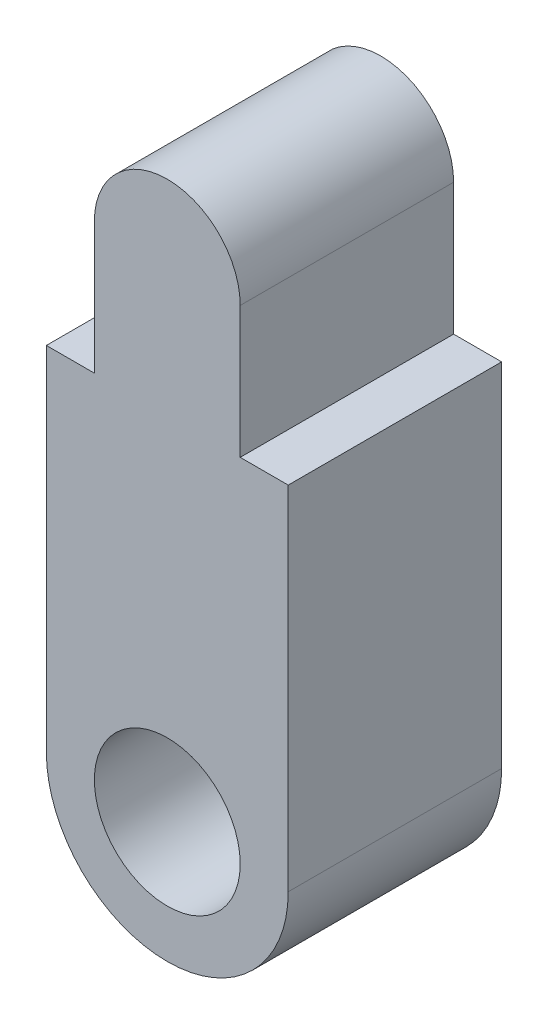
ISO-10303-21;
HEADER;
FILE_DESCRIPTION(('STEP AP214'),'2;1');
FILE_NAME('part.step','',(''),(''),'','','');
FILE_SCHEMA(('AUTOMOTIVE_DESIGN { 1 0 10303 214 1 1 1 1 }'));
ENDSEC;
DATA;
#1=APPLICATION_CONTEXT('core data for automotive mechanical design processes');
#2=APPLICATION_PROTOCOL_DEFINITION('international standard','automotive_design',2000,#1);
#3=PRODUCT_CONTEXT('',#1,'mechanical');
#4=PRODUCT('Part','Part','',(#3));
#5=PRODUCT_RELATED_PRODUCT_CATEGORY('part','',(#4));
#6=PRODUCT_DEFINITION_FORMATION('','',#4);
#7=PRODUCT_DEFINITION_CONTEXT('part definition',#1,'design');
#8=PRODUCT_DEFINITION('design','',#6,#7);
#9=PRODUCT_DEFINITION_SHAPE('','',#8);
#10=(LENGTH_UNIT() NAMED_UNIT(*) SI_UNIT(.MILLI.,.METRE.));
#11=(NAMED_UNIT(*) PLANE_ANGLE_UNIT() SI_UNIT($,.RADIAN.));
#12=(NAMED_UNIT(*) SI_UNIT($,.STERADIAN.) SOLID_ANGLE_UNIT());
#13=UNCERTAINTY_MEASURE_WITH_UNIT(LENGTH_MEASURE(1.E-05),#10,'distance_accuracy_value','');
#14=(GEOMETRIC_REPRESENTATION_CONTEXT(3) GLOBAL_UNCERTAINTY_ASSIGNED_CONTEXT((#13)) GLOBAL_UNIT_ASSIGNED_CONTEXT((#10,
#11,#12)) REPRESENTATION_CONTEXT('',''));
#15=CARTESIAN_POINT('',(0.,0.,0.));
#16=DIRECTION('',(0.,0.,1.));
#17=DIRECTION('',(1.,0.,0.));
#18=AXIS2_PLACEMENT_3D('',#15,#16,#17);
#19=CARTESIAN_POINT('',(-17.,0.,30.));
#20=DIRECTION('',(1.,0.,0.));
#21=DIRECTION('',(0.,1.,0.));
#22=AXIS2_PLACEMENT_3D('',#19,#20,#21);
#23=PLANE('',#22);
#24=DIRECTION('',(0.,-1.,0.));
#25=VECTOR('',#24,1.);
#26=CARTESIAN_POINT('',(-17.,0.,0.));
#27=LINE('',#26,#25);
#28=CARTESIAN_POINT('',(-17.,-18.4931792674009,0.));
#29=VERTEX_POINT('',#28);
#30=CARTESIAN_POINT('',(-17.,-68.,0.));
#31=VERTEX_POINT('',#30);
#32=EDGE_CURVE('E155',#29,#31,#27,.T.);
#33=ORIENTED_EDGE('',*,*,#32,.T.);
#34=DIRECTION('',(0.,0.,-1.));
#35=VECTOR('',#34,1.);
#36=CARTESIAN_POINT('',(-17.,-68.,30.));
#37=LINE('',#36,#35);
#38=CARTESIAN_POINT('',(-17.,-68.,30.));
#39=VERTEX_POINT('',#38);
#40=EDGE_CURVE('E11',#39,#31,#37,.T.);
#41=ORIENTED_EDGE('',*,*,#40,.F.);
#42=DIRECTION('',(0.,-1.,0.));
#43=VECTOR('',#42,1.);
#44=CARTESIAN_POINT('',(-17.,0.,30.));
#45=LINE('',#44,#43);
#46=CARTESIAN_POINT('',(-17.,-18.4931792674009,30.));
#47=VERTEX_POINT('',#46);
#48=EDGE_CURVE('E211',#47,#39,#45,.T.);
#49=ORIENTED_EDGE('',*,*,#48,.F.);
#50=DIRECTION('',(0.,0.,-1.));
#51=VECTOR('',#50,1.);
#52=CARTESIAN_POINT('',(-17.,-18.4931792674009,30.));
#53=LINE('',#52,#51);
#54=EDGE_CURVE('E65',#47,#29,#53,.T.);
#55=ORIENTED_EDGE('',*,*,#54,.T.);
#56=EDGE_LOOP('',(#33,#41,#49,#55));
#57=FACE_BOUND('',#56,.T.);
#58=ADVANCED_FACE('F47',(#57),#23,.F.);
#59=CARTESIAN_POINT('',(0.,-68.,30.));
#60=DIRECTION('',(0.,0.,-1.));
#61=DIRECTION('',(-1.,0.,0.));
#62=AXIS2_PLACEMENT_3D('',#59,#60,#61);
#63=CYLINDRICAL_SURFACE('',#62,17.);
#64=CARTESIAN_POINT('',(0.,-68.,0.));
#65=DIRECTION('',(0.,0.,1.));
#66=DIRECTION('',(1.,0.,0.));
#67=AXIS2_PLACEMENT_3D('',#64,#65,#66);
#68=CIRCLE('',#67,17.);
#69=CARTESIAN_POINT('',(17.,-68.,0.));
#70=VERTEX_POINT('',#69);
#71=EDGE_CURVE('E158',#31,#70,#68,.T.);
#72=ORIENTED_EDGE('',*,*,#71,.T.);
#73=DIRECTION('',(0.,0.,-1.));
#74=VECTOR('',#73,1.);
#75=CARTESIAN_POINT('',(17.,-68.,30.));
#76=LINE('',#75,#74);
#77=CARTESIAN_POINT('',(17.,-68.,30.));
#78=VERTEX_POINT('',#77);
#79=EDGE_CURVE('E57',#78,#70,#76,.T.);
#80=ORIENTED_EDGE('',*,*,#79,.F.);
#81=CARTESIAN_POINT('',(0.,-68.,30.));
#82=DIRECTION('',(0.,0.,1.));
#83=DIRECTION('',(1.,0.,0.));
#84=AXIS2_PLACEMENT_3D('',#81,#82,#83);
#85=CIRCLE('',#84,17.);
#86=EDGE_CURVE('E104',#39,#78,#85,.T.);
#87=ORIENTED_EDGE('',*,*,#86,.F.);
#88=ORIENTED_EDGE('',*,*,#40,.T.);
#89=EDGE_LOOP('',(#72,#80,#87,#88));
#90=FACE_BOUND('',#89,.T.);
#91=ADVANCED_FACE('F198',(#90),#63,.T.);
#92=CARTESIAN_POINT('',(17.,0.,30.));
#93=DIRECTION('',(1.,0.,0.));
#94=DIRECTION('',(0.,1.,0.));
#95=AXIS2_PLACEMENT_3D('',#92,#93,#94);
#96=PLANE('',#95);
#97=DIRECTION('',(0.,-1.,0.));
#98=VECTOR('',#97,1.);
#99=CARTESIAN_POINT('',(17.,0.,0.));
#100=LINE('',#99,#98);
#101=CARTESIAN_POINT('',(17.,-18.4931792674009,0.));
#102=VERTEX_POINT('',#101);
#103=EDGE_CURVE('E162',#102,#70,#100,.T.);
#104=ORIENTED_EDGE('',*,*,#103,.F.);
#105=DIRECTION('',(0.,0.,-1.));
#106=VECTOR('',#105,1.);
#107=CARTESIAN_POINT('',(17.,-18.4931792674009,30.));
#108=LINE('',#107,#106);
#109=CARTESIAN_POINT('',(17.,-18.4931792674009,30.));
#110=VERTEX_POINT('',#109);
#111=EDGE_CURVE('E189',#110,#102,#108,.T.);
#112=ORIENTED_EDGE('',*,*,#111,.F.);
#113=DIRECTION('',(0.,-1.,0.));
#114=VECTOR('',#113,1.);
#115=CARTESIAN_POINT('',(17.,0.,30.));
#116=LINE('',#115,#114);
#117=EDGE_CURVE('E197',#110,#78,#116,.T.);
#118=ORIENTED_EDGE('',*,*,#117,.T.);
#119=ORIENTED_EDGE('',*,*,#79,.T.);
#120=EDGE_LOOP('',(#104,#112,#118,#119));
#121=FACE_BOUND('',#120,.T.);
#122=ADVANCED_FACE('F195',(#121),#96,.T.);
#123=CARTESIAN_POINT('',(0.,-18.4931792674009,30.));
#124=DIRECTION('',(0.,1.,0.));
#125=DIRECTION('',(0.,0.,1.));
#126=AXIS2_PLACEMENT_3D('',#123,#124,#125);
#127=PLANE('',#126);
#128=DIRECTION('',(1.,0.,0.));
#129=VECTOR('',#128,1.);
#130=CARTESIAN_POINT('',(0.,-18.4931792674009,0.));
#131=LINE('',#130,#129);
#132=CARTESIAN_POINT('',(10.25,-18.4931792674009,0.));
#133=VERTEX_POINT('',#132);
#134=EDGE_CURVE('E166',#133,#102,#131,.T.);
#135=ORIENTED_EDGE('',*,*,#134,.F.);
#136=DIRECTION('',(0.,0.,-1.));
#137=VECTOR('',#136,1.);
#138=CARTESIAN_POINT('',(10.25,-18.4931792674009,30.));
#139=LINE('',#138,#137);
#140=CARTESIAN_POINT('',(10.25,-18.4931792674009,30.));
#141=VERTEX_POINT('',#140);
#142=EDGE_CURVE('E186',#141,#133,#139,.T.);
#143=ORIENTED_EDGE('',*,*,#142,.F.);
#144=DIRECTION('',(1.,0.,0.));
#145=VECTOR('',#144,1.);
#146=CARTESIAN_POINT('',(0.,-18.4931792674009,30.));
#147=LINE('',#146,#145);
#148=EDGE_CURVE('E148',#141,#110,#147,.T.);
#149=ORIENTED_EDGE('',*,*,#148,.T.);
#150=ORIENTED_EDGE('',*,*,#111,.T.);
#151=EDGE_LOOP('',(#135,#143,#149,#150));
#152=FACE_BOUND('',#151,.T.);
#153=ADVANCED_FACE('F205',(#152),#127,.T.);
#154=CARTESIAN_POINT('',(10.25,0.,30.));
#155=DIRECTION('',(1.,0.,0.));
#156=DIRECTION('',(0.,1.,0.));
#157=AXIS2_PLACEMENT_3D('',#154,#155,#156);
#158=PLANE('',#157);
#159=DIRECTION('',(0.,-1.,0.));
#160=VECTOR('',#159,1.);
#161=CARTESIAN_POINT('',(10.25,0.,0.));
#162=LINE('',#161,#160);
#163=CARTESIAN_POINT('',(10.25,0.,0.));
#164=VERTEX_POINT('',#163);
#165=EDGE_CURVE('E170',#164,#133,#162,.T.);
#166=ORIENTED_EDGE('',*,*,#165,.F.);
#167=DIRECTION('',(0.,0.,-1.));
#168=VECTOR('',#167,1.);
#169=CARTESIAN_POINT('',(10.25,0.,30.));
#170=LINE('',#169,#168);
#171=CARTESIAN_POINT('',(10.25,0.,30.));
#172=VERTEX_POINT('',#171);
#173=EDGE_CURVE('E140',#172,#164,#170,.T.);
#174=ORIENTED_EDGE('',*,*,#173,.F.);
#175=DIRECTION('',(0.,-1.,0.));
#176=VECTOR('',#175,1.);
#177=CARTESIAN_POINT('',(10.25,0.,30.));
#178=LINE('',#177,#176);
#179=EDGE_CURVE('E128',#172,#141,#178,.T.);
#180=ORIENTED_EDGE('',*,*,#179,.T.);
#181=ORIENTED_EDGE('',*,*,#142,.T.);
#182=EDGE_LOOP('',(#166,#174,#180,#181));
#183=FACE_BOUND('',#182,.T.);
#184=ADVANCED_FACE('F216',(#183),#158,.T.);
#185=CARTESIAN_POINT('',(0.,0.,30.));
#186=DIRECTION('',(0.,0.,-1.));
#187=DIRECTION('',(-1.,0.,0.));
#188=AXIS2_PLACEMENT_3D('',#185,#186,#187);
#189=CYLINDRICAL_SURFACE('',#188,10.25);
#190=CARTESIAN_POINT('',(0.,0.,0.));
#191=DIRECTION('',(0.,0.,1.));
#192=DIRECTION('',(1.,0.,0.));
#193=AXIS2_PLACEMENT_3D('',#190,#191,#192);
#194=CIRCLE('',#193,10.25);
#195=CARTESIAN_POINT('',(-10.25,0.,0.));
#196=VERTEX_POINT('',#195);
#197=EDGE_CURVE('E136',#164,#196,#194,.T.);
#198=ORIENTED_EDGE('',*,*,#197,.T.);
#199=DIRECTION('',(0.,0.,-1.));
#200=VECTOR('',#199,1.);
#201=CARTESIAN_POINT('',(-10.25,0.,30.));
#202=LINE('',#201,#200);
#203=CARTESIAN_POINT('',(-10.25,0.,30.));
#204=VERTEX_POINT('',#203);
#205=EDGE_CURVE('E133',#204,#196,#202,.T.);
#206=ORIENTED_EDGE('',*,*,#205,.F.);
#207=CARTESIAN_POINT('',(0.,0.,30.));
#208=DIRECTION('',(0.,0.,1.));
#209=DIRECTION('',(1.,0.,0.));
#210=AXIS2_PLACEMENT_3D('',#207,#208,#209);
#211=CIRCLE('',#210,10.25);
#212=EDGE_CURVE('E120',#172,#204,#211,.T.);
#213=ORIENTED_EDGE('',*,*,#212,.F.);
#214=ORIENTED_EDGE('',*,*,#173,.T.);
#215=EDGE_LOOP('',(#198,#206,#213,#214));
#216=FACE_BOUND('',#215,.T.);
#217=ADVANCED_FACE('F134',(#216),#189,.T.);
#218=CARTESIAN_POINT('',(-10.25,0.,30.));
#219=DIRECTION('',(1.,0.,0.));
#220=DIRECTION('',(0.,1.,0.));
#221=AXIS2_PLACEMENT_3D('',#218,#219,#220);
#222=PLANE('',#221);
#223=DIRECTION('',(0.,-1.,0.));
#224=VECTOR('',#223,1.);
#225=CARTESIAN_POINT('',(-10.25,0.,0.));
#226=LINE('',#225,#224);
#227=CARTESIAN_POINT('',(-10.25,-18.4931792674009,0.));
#228=VERTEX_POINT('',#227);
#229=EDGE_CURVE('E177',#196,#228,#226,.T.);
#230=ORIENTED_EDGE('',*,*,#229,.T.);
#231=DIRECTION('',(0.,0.,-1.));
#232=VECTOR('',#231,1.);
#233=CARTESIAN_POINT('',(-10.25,-18.4931792674009,30.));
#234=LINE('',#233,#232);
#235=CARTESIAN_POINT('',(-10.25,-18.4931792674009,30.));
#236=VERTEX_POINT('',#235);
#237=EDGE_CURVE('E92',#236,#228,#234,.T.);
#238=ORIENTED_EDGE('',*,*,#237,.F.);
#239=DIRECTION('',(0.,-1.,0.));
#240=VECTOR('',#239,1.);
#241=CARTESIAN_POINT('',(-10.25,0.,30.));
#242=LINE('',#241,#240);
#243=EDGE_CURVE('E125',#204,#236,#242,.T.);
#244=ORIENTED_EDGE('',*,*,#243,.F.);
#245=ORIENTED_EDGE('',*,*,#205,.T.);
#246=EDGE_LOOP('',(#230,#238,#244,#245));
#247=FACE_BOUND('',#246,.T.);
#248=ADVANCED_FACE('F142',(#247),#222,.F.);
#249=CARTESIAN_POINT('',(0.,-68.,30.));
#250=DIRECTION('',(0.,0.,-1.));
#251=DIRECTION('',(-1.,0.,0.));
#252=AXIS2_PLACEMENT_3D('',#249,#250,#251);
#253=CYLINDRICAL_SURFACE('',#252,10.25);
#254=CARTESIAN_POINT('',(0.,-68.,30.));
#255=DIRECTION('',(0.,0.,1.));
#256=DIRECTION('',(1.,0.,0.));
#257=AXIS2_PLACEMENT_3D('',#254,#255,#256);
#258=CIRCLE('',#257,10.25);
#259=CARTESIAN_POINT('',(10.25,-68.,30.));
#260=VERTEX_POINT('',#259);
#261=EDGE_CURVE('E219',#260,#260,#258,.T.);
#262=ORIENTED_EDGE('',*,*,#261,.T.);
#263=EDGE_LOOP('',(#262));
#264=FACE_BOUND('',#263,.T.);
#265=CARTESIAN_POINT('',(0.,-68.,0.));
#266=DIRECTION('',(0.,0.,1.));
#267=DIRECTION('',(1.,0.,0.));
#268=AXIS2_PLACEMENT_3D('',#265,#266,#267);
#269=CIRCLE('',#268,10.25);
#270=CARTESIAN_POINT('',(10.25,-68.,0.));
#271=VERTEX_POINT('',#270);
#272=EDGE_CURVE('E151',#271,#271,#269,.T.);
#273=ORIENTED_EDGE('',*,*,#272,.F.);
#274=EDGE_LOOP('',(#273));
#275=FACE_BOUND('',#274,.T.);
#276=ADVANCED_FACE('F49',(#264,#275),#253,.F.);
#277=EDGE_CURVE('E171',#29,#228,#131,.T.);
#278=ORIENTED_EDGE('',*,*,#277,.F.);
#279=ORIENTED_EDGE('',*,*,#54,.F.);
#280=EDGE_CURVE('E144',#47,#236,#147,.T.);
#281=ORIENTED_EDGE('',*,*,#280,.T.);
#282=ORIENTED_EDGE('',*,*,#237,.T.);
#283=EDGE_LOOP('',(#278,#279,#281,#282));
#284=FACE_BOUND('',#283,.T.);
#285=ADVANCED_FACE('F240',(#284),#127,.T.);
#286=CARTESIAN_POINT('',(0.,0.,30.));
#287=DIRECTION('',(0.,0.,1.));
#288=DIRECTION('',(1.,0.,0.));
#289=AXIS2_PLACEMENT_3D('',#286,#287,#288);
#290=PLANE('',#289);
#291=ORIENTED_EDGE('',*,*,#261,.F.);
#292=EDGE_LOOP('',(#291));
#293=FACE_BOUND('',#292,.T.);
#294=ORIENTED_EDGE('',*,*,#48,.T.);
#295=ORIENTED_EDGE('',*,*,#86,.T.);
#296=ORIENTED_EDGE('',*,*,#117,.F.);
#297=ORIENTED_EDGE('',*,*,#148,.F.);
#298=ORIENTED_EDGE('',*,*,#179,.F.);
#299=ORIENTED_EDGE('',*,*,#212,.T.);
#300=ORIENTED_EDGE('',*,*,#243,.T.);
#301=ORIENTED_EDGE('',*,*,#280,.F.);
#302=EDGE_LOOP('',(#294,#295,#296,#297,#298,#299,#300,#301));
#303=FACE_BOUND('',#302,.T.);
#304=ADVANCED_FACE('F122',(#293,#303),#290,.T.);
#305=CARTESIAN_POINT('',(0.,0.,0.));
#306=DIRECTION('',(0.,0.,1.));
#307=DIRECTION('',(1.,0.,0.));
#308=AXIS2_PLACEMENT_3D('',#305,#306,#307);
#309=PLANE('',#308);
#310=ORIENTED_EDGE('',*,*,#272,.T.);
#311=EDGE_LOOP('',(#310));
#312=FACE_BOUND('',#311,.T.);
#313=ORIENTED_EDGE('',*,*,#32,.F.);
#314=ORIENTED_EDGE('',*,*,#277,.T.);
#315=ORIENTED_EDGE('',*,*,#229,.F.);
#316=ORIENTED_EDGE('',*,*,#197,.F.);
#317=ORIENTED_EDGE('',*,*,#165,.T.);
#318=ORIENTED_EDGE('',*,*,#134,.T.);
#319=ORIENTED_EDGE('',*,*,#103,.T.);
#320=ORIENTED_EDGE('',*,*,#71,.F.);
#321=EDGE_LOOP('',(#313,#314,#315,#316,#317,#318,#319,#320));
#322=FACE_BOUND('',#321,.T.);
#323=ADVANCED_FACE('F201',(#312,#322),#309,.F.);
#324=CLOSED_SHELL('',(#58,#91,#122,#153,#184,#217,#248,#276,#285,#304,#323));
#325=MANIFOLD_SOLID_BREP('B2',#324);
#326=ADVANCED_BREP_SHAPE_REPRESENTATION('',(#18,#325),#14);
#327=SHAPE_DEFINITION_REPRESENTATION(#9,#326);
ENDSEC;
END-ISO-10303-21;
